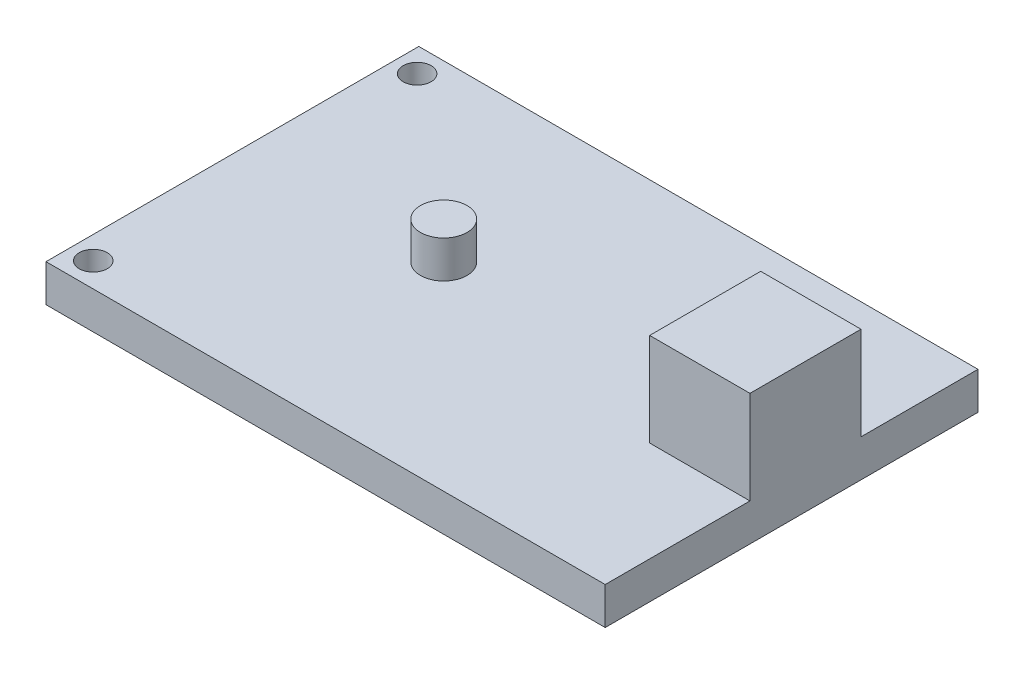
ISO-10303-21;
HEADER;
FILE_DESCRIPTION(('STEP AP214'),'2;1');
FILE_NAME('part.step','',(''),(''),'','','');
FILE_SCHEMA(('AUTOMOTIVE_DESIGN { 1 0 10303 214 1 1 1 1 }'));
ENDSEC;
DATA;
#1=APPLICATION_CONTEXT('core data for automotive mechanical design processes');
#2=APPLICATION_PROTOCOL_DEFINITION('international standard','automotive_design',2000,#1);
#3=PRODUCT_CONTEXT('',#1,'mechanical');
#4=PRODUCT('Part','Part','',(#3));
#5=PRODUCT_RELATED_PRODUCT_CATEGORY('part','',(#4));
#6=PRODUCT_DEFINITION_FORMATION('','',#4);
#7=PRODUCT_DEFINITION_CONTEXT('part definition',#1,'design');
#8=PRODUCT_DEFINITION('design','',#6,#7);
#9=PRODUCT_DEFINITION_SHAPE('','',#8);
#10=(LENGTH_UNIT() NAMED_UNIT(*) SI_UNIT(.MILLI.,.METRE.));
#11=(NAMED_UNIT(*) PLANE_ANGLE_UNIT() SI_UNIT($,.RADIAN.));
#12=(NAMED_UNIT(*) SI_UNIT($,.STERADIAN.) SOLID_ANGLE_UNIT());
#13=UNCERTAINTY_MEASURE_WITH_UNIT(LENGTH_MEASURE(1.E-05),#10,'distance_accuracy_value','');
#14=(GEOMETRIC_REPRESENTATION_CONTEXT(3) GLOBAL_UNCERTAINTY_ASSIGNED_CONTEXT((#13)) GLOBAL_UNIT_ASSIGNED_CONTEXT((#10,
#11,#12)) REPRESENTATION_CONTEXT('',''));
#15=CARTESIAN_POINT('',(0.,0.,0.));
#16=DIRECTION('',(0.,0.,1.));
#17=DIRECTION('',(1.,0.,0.));
#18=AXIS2_PLACEMENT_3D('',#15,#16,#17);
#19=CARTESIAN_POINT('',(0.,2.,0.));
#20=DIRECTION('',(0.,1.,0.));
#21=DIRECTION('',(0.,0.,1.));
#22=AXIS2_PLACEMENT_3D('',#19,#20,#21);
#23=PLANE('',#22);
#24=CARTESIAN_POINT('',(-4.31314717029003,2.,-0.651626550907135));
#25=DIRECTION('',(0.,1.,0.));
#26=DIRECTION('',(0.,0.,1.));
#27=AXIS2_PLACEMENT_3D('',#24,#25,#26);
#28=CIRCLE('',#27,1.25);
#29=CARTESIAN_POINT('',(-4.31314717029003,2.,0.598373449092865));
#30=VERTEX_POINT('',#29);
#31=EDGE_CURVE('E140',#30,#30,#28,.T.);
#32=ORIENTED_EDGE('',*,*,#31,.F.);
#33=EDGE_LOOP('',(#32));
#34=FACE_BOUND('',#33,.T.);
#35=CARTESIAN_POINT('',(-13.7772470763221,2.,-8.68835401209501));
#36=DIRECTION('',(0.,-1.,0.));
#37=DIRECTION('',(0.,0.,-1.));
#38=AXIS2_PLACEMENT_3D('',#35,#36,#37);
#39=CIRCLE('',#38,0.75);
#40=CARTESIAN_POINT('',(-13.7772470763221,2.,-9.43835401209501));
#41=VERTEX_POINT('',#40);
#42=EDGE_CURVE('E149',#41,#41,#39,.T.);
#43=ORIENTED_EDGE('',*,*,#42,.T.);
#44=EDGE_LOOP('',(#43));
#45=FACE_BOUND('',#44,.T.);
#46=CARTESIAN_POINT('',(-13.7772470763221,2.,8.68835401209501));
#47=DIRECTION('',(0.,1.,0.));
#48=DIRECTION('',(0.,0.,1.));
#49=AXIS2_PLACEMENT_3D('',#46,#47,#48);
#50=CIRCLE('',#49,0.75);
#51=CARTESIAN_POINT('',(-13.7772470763221,2.,9.43835401209501));
#52=VERTEX_POINT('',#51);
#53=EDGE_CURVE('E154',#52,#52,#50,.T.);
#54=ORIENTED_EDGE('',*,*,#53,.F.);
#55=EDGE_LOOP('',(#54));
#56=FACE_BOUND('',#55,.T.);
#57=DIRECTION('',(0.,0.,1.));
#58=VECTOR('',#57,1.);
#59=CARTESIAN_POINT('',(9.61924908481949,2.,-3.72358029089787));
#60=LINE('',#59,#58);
#61=CARTESIAN_POINT('',(9.61924908481949,2.,-3.72358029089787));
#62=VERTEX_POINT('',#61);
#63=CARTESIAN_POINT('',(9.61924908481949,2.,2.23414817453872));
#64=VERTEX_POINT('',#63);
#65=EDGE_CURVE('E331',#62,#64,#60,.T.);
#66=ORIENTED_EDGE('',*,*,#65,.F.);
#67=DIRECTION('',(-1.,0.,0.));
#68=VECTOR('',#67,1.);
#69=CARTESIAN_POINT('',(15.,2.,-3.72358029089787));
#70=LINE('',#69,#68);
#71=CARTESIAN_POINT('',(15.,2.,-3.72358029089787));
#72=VERTEX_POINT('',#71);
#73=EDGE_CURVE('E332',#72,#62,#70,.T.);
#74=ORIENTED_EDGE('',*,*,#73,.F.);
#75=DIRECTION('',(0.,0.,-1.));
#76=VECTOR('',#75,1.);
#77=CARTESIAN_POINT('',(15.,2.,-10.));
#78=LINE('',#77,#76);
#79=CARTESIAN_POINT('',(15.,2.,-10.));
#80=VERTEX_POINT('',#79);
#81=EDGE_CURVE('E95',#72,#80,#78,.T.);
#82=ORIENTED_EDGE('',*,*,#81,.T.);
#83=DIRECTION('',(-1.,0.,0.));
#84=VECTOR('',#83,1.);
#85=CARTESIAN_POINT('',(-15.,2.,-10.));
#86=LINE('',#85,#84);
#87=CARTESIAN_POINT('',(-15.,2.,-10.));
#88=VERTEX_POINT('',#87);
#89=EDGE_CURVE('E165',#80,#88,#86,.T.);
#90=ORIENTED_EDGE('',*,*,#89,.T.);
#91=DIRECTION('',(0.,0.,1.));
#92=VECTOR('',#91,1.);
#93=CARTESIAN_POINT('',(-15.,2.,-10.));
#94=LINE('',#93,#92);
#95=CARTESIAN_POINT('',(-15.,2.,10.));
#96=VERTEX_POINT('',#95);
#97=EDGE_CURVE('E167',#88,#96,#94,.T.);
#98=ORIENTED_EDGE('',*,*,#97,.T.);
#99=DIRECTION('',(1.,0.,0.));
#100=VECTOR('',#99,1.);
#101=CARTESIAN_POINT('',(-15.,2.,10.));
#102=LINE('',#101,#100);
#103=CARTESIAN_POINT('',(15.,2.,10.));
#104=VERTEX_POINT('',#103);
#105=EDGE_CURVE('E67',#96,#104,#102,.T.);
#106=ORIENTED_EDGE('',*,*,#105,.T.);
#107=CARTESIAN_POINT('',(15.,2.,2.23414817453872));
#108=VERTEX_POINT('',#107);
#109=EDGE_CURVE('E163',#104,#108,#78,.T.);
#110=ORIENTED_EDGE('',*,*,#109,.T.);
#111=DIRECTION('',(1.,0.,0.));
#112=VECTOR('',#111,1.);
#113=CARTESIAN_POINT('',(15.,2.,2.23414817453872));
#114=LINE('',#113,#112);
#115=EDGE_CURVE('E136',#64,#108,#114,.T.);
#116=ORIENTED_EDGE('',*,*,#115,.F.);
#117=EDGE_LOOP('',(#66,#74,#82,#90,#98,#106,#110,#116));
#118=FACE_BOUND('',#117,.T.);
#119=ADVANCED_FACE('F43',(#34,#45,#56,#118),#23,.T.);
#120=CARTESIAN_POINT('',(15.,2.,-10.));
#121=DIRECTION('',(-1.,0.,0.));
#122=DIRECTION('',(0.,0.,1.));
#123=AXIS2_PLACEMENT_3D('',#120,#121,#122);
#124=PLANE('',#123);
#125=DIRECTION('',(0.,0.,-1.));
#126=VECTOR('',#125,1.);
#127=CARTESIAN_POINT('',(15.,0.,-10.));
#128=LINE('',#127,#126);
#129=CARTESIAN_POINT('',(15.,0.,10.));
#130=VERTEX_POINT('',#129);
#131=CARTESIAN_POINT('',(15.,0.,-10.));
#132=VERTEX_POINT('',#131);
#133=EDGE_CURVE('E160',#130,#132,#128,.T.);
#134=ORIENTED_EDGE('',*,*,#133,.T.);
#135=DIRECTION('',(0.,-1.,0.));
#136=VECTOR('',#135,1.);
#137=CARTESIAN_POINT('',(15.,2.,-10.));
#138=LINE('',#137,#136);
#139=EDGE_CURVE('E11',#80,#132,#138,.T.);
#140=ORIENTED_EDGE('',*,*,#139,.F.);
#141=ORIENTED_EDGE('',*,*,#81,.F.);
#142=DIRECTION('',(0.,-1.,0.));
#143=VECTOR('',#142,1.);
#144=CARTESIAN_POINT('',(15.,7.,-3.72358029089787));
#145=LINE('',#144,#143);
#146=CARTESIAN_POINT('',(15.,7.,-3.72358029089787));
#147=VERTEX_POINT('',#146);
#148=EDGE_CURVE('E122',#147,#72,#145,.T.);
#149=ORIENTED_EDGE('',*,*,#148,.F.);
#150=DIRECTION('',(0.,0.,-1.));
#151=VECTOR('',#150,1.);
#152=CARTESIAN_POINT('',(15.,7.,-3.72358029089787));
#153=LINE('',#152,#151);
#154=CARTESIAN_POINT('',(15.,7.,2.23414817453872));
#155=VERTEX_POINT('',#154);
#156=EDGE_CURVE('E128',#155,#147,#153,.T.);
#157=ORIENTED_EDGE('',*,*,#156,.F.);
#158=DIRECTION('',(0.,-1.,0.));
#159=VECTOR('',#158,1.);
#160=CARTESIAN_POINT('',(15.,7.,2.23414817453872));
#161=LINE('',#160,#159);
#162=EDGE_CURVE('E338',#155,#108,#161,.T.);
#163=ORIENTED_EDGE('',*,*,#162,.T.);
#164=ORIENTED_EDGE('',*,*,#109,.F.);
#165=DIRECTION('',(0.,-1.,0.));
#166=VECTOR('',#165,1.);
#167=CARTESIAN_POINT('',(15.,2.,10.));
#168=LINE('',#167,#166);
#169=EDGE_CURVE('E170',#104,#130,#168,.T.);
#170=ORIENTED_EDGE('',*,*,#169,.T.);
#171=EDGE_LOOP('',(#134,#140,#141,#149,#157,#163,#164,#170));
#172=FACE_BOUND('',#171,.T.);
#173=ADVANCED_FACE('F45',(#172),#124,.F.);
#174=CARTESIAN_POINT('',(-15.,2.,-10.));
#175=DIRECTION('',(0.,0.,1.));
#176=DIRECTION('',(1.,0.,0.));
#177=AXIS2_PLACEMENT_3D('',#174,#175,#176);
#178=PLANE('',#177);
#179=DIRECTION('',(-1.,0.,0.));
#180=VECTOR('',#179,1.);
#181=CARTESIAN_POINT('',(-15.,0.,-10.));
#182=LINE('',#181,#180);
#183=CARTESIAN_POINT('',(-15.,0.,-10.));
#184=VERTEX_POINT('',#183);
#185=EDGE_CURVE('E172',#132,#184,#182,.T.);
#186=ORIENTED_EDGE('',*,*,#185,.T.);
#187=DIRECTION('',(0.,-1.,0.));
#188=VECTOR('',#187,1.);
#189=CARTESIAN_POINT('',(-15.,2.,-10.));
#190=LINE('',#189,#188);
#191=EDGE_CURVE('E51',#88,#184,#190,.T.);
#192=ORIENTED_EDGE('',*,*,#191,.F.);
#193=ORIENTED_EDGE('',*,*,#89,.F.);
#194=ORIENTED_EDGE('',*,*,#139,.T.);
#195=EDGE_LOOP('',(#186,#192,#193,#194));
#196=FACE_BOUND('',#195,.T.);
#197=ADVANCED_FACE('F201',(#196),#178,.F.);
#198=CARTESIAN_POINT('',(-15.,2.,-10.));
#199=DIRECTION('',(1.,0.,0.));
#200=DIRECTION('',(0.,0.,-1.));
#201=AXIS2_PLACEMENT_3D('',#198,#199,#200);
#202=PLANE('',#201);
#203=DIRECTION('',(0.,0.,1.));
#204=VECTOR('',#203,1.);
#205=CARTESIAN_POINT('',(-15.,0.,-10.));
#206=LINE('',#205,#204);
#207=CARTESIAN_POINT('',(-15.,0.,10.));
#208=VERTEX_POINT('',#207);
#209=EDGE_CURVE('E174',#184,#208,#206,.T.);
#210=ORIENTED_EDGE('',*,*,#209,.T.);
#211=DIRECTION('',(0.,-1.,0.));
#212=VECTOR('',#211,1.);
#213=CARTESIAN_POINT('',(-15.,2.,10.));
#214=LINE('',#213,#212);
#215=EDGE_CURVE('E178',#96,#208,#214,.T.);
#216=ORIENTED_EDGE('',*,*,#215,.F.);
#217=ORIENTED_EDGE('',*,*,#97,.F.);
#218=ORIENTED_EDGE('',*,*,#191,.T.);
#219=EDGE_LOOP('',(#210,#216,#217,#218));
#220=FACE_BOUND('',#219,.T.);
#221=ADVANCED_FACE('F184',(#220),#202,.F.);
#222=CARTESIAN_POINT('',(-15.,2.,10.));
#223=DIRECTION('',(0.,0.,-1.));
#224=DIRECTION('',(-1.,0.,0.));
#225=AXIS2_PLACEMENT_3D('',#222,#223,#224);
#226=PLANE('',#225);
#227=DIRECTION('',(1.,0.,0.));
#228=VECTOR('',#227,1.);
#229=CARTESIAN_POINT('',(-15.,0.,10.));
#230=LINE('',#229,#228);
#231=EDGE_CURVE('E88',#208,#130,#230,.T.);
#232=ORIENTED_EDGE('',*,*,#231,.T.);
#233=ORIENTED_EDGE('',*,*,#169,.F.);
#234=ORIENTED_EDGE('',*,*,#105,.F.);
#235=ORIENTED_EDGE('',*,*,#215,.T.);
#236=EDGE_LOOP('',(#232,#233,#234,#235));
#237=FACE_BOUND('',#236,.T.);
#238=ADVANCED_FACE('F191',(#237),#226,.F.);
#239=CARTESIAN_POINT('',(0.,0.,0.));
#240=DIRECTION('',(0.,1.,0.));
#241=DIRECTION('',(0.,0.,1.));
#242=AXIS2_PLACEMENT_3D('',#239,#240,#241);
#243=PLANE('',#242);
#244=CARTESIAN_POINT('',(-13.7772470763221,0.,-8.68835401209501));
#245=DIRECTION('',(0.,-1.,0.));
#246=DIRECTION('',(0.,0.,-1.));
#247=AXIS2_PLACEMENT_3D('',#244,#245,#246);
#248=CIRCLE('',#247,0.75);
#249=CARTESIAN_POINT('',(-13.7772470763221,0.,-9.43835401209501));
#250=VERTEX_POINT('',#249);
#251=EDGE_CURVE('E151',#250,#250,#248,.T.);
#252=ORIENTED_EDGE('',*,*,#251,.F.);
#253=EDGE_LOOP('',(#252));
#254=FACE_BOUND('',#253,.T.);
#255=CARTESIAN_POINT('',(-13.7772470763221,0.,8.68835401209501));
#256=DIRECTION('',(0.,1.,0.));
#257=DIRECTION('',(0.,0.,1.));
#258=AXIS2_PLACEMENT_3D('',#255,#256,#257);
#259=CIRCLE('',#258,0.75);
#260=CARTESIAN_POINT('',(-13.7772470763221,0.,9.43835401209501));
#261=VERTEX_POINT('',#260);
#262=EDGE_CURVE('E157',#261,#261,#259,.T.);
#263=ORIENTED_EDGE('',*,*,#262,.T.);
#264=EDGE_LOOP('',(#263));
#265=FACE_BOUND('',#264,.T.);
#266=ORIENTED_EDGE('',*,*,#133,.F.);
#267=ORIENTED_EDGE('',*,*,#231,.F.);
#268=ORIENTED_EDGE('',*,*,#209,.F.);
#269=ORIENTED_EDGE('',*,*,#185,.F.);
#270=EDGE_LOOP('',(#266,#267,#268,#269));
#271=FACE_BOUND('',#270,.T.);
#272=ADVANCED_FACE('F189',(#254,#265,#271),#243,.F.);
#273=CARTESIAN_POINT('',(-13.7772470763221,0.,8.68835401209501));
#274=DIRECTION('',(0.,1.,0.));
#275=DIRECTION('',(0.,0.,1.));
#276=AXIS2_PLACEMENT_3D('',#273,#274,#275);
#277=CYLINDRICAL_SURFACE('',#276,0.75);
#278=ORIENTED_EDGE('',*,*,#262,.F.);
#279=EDGE_LOOP('',(#278));
#280=FACE_BOUND('',#279,.T.);
#281=ORIENTED_EDGE('',*,*,#53,.T.);
#282=EDGE_LOOP('',(#281));
#283=FACE_BOUND('',#282,.T.);
#284=ADVANCED_FACE('F198',(#280,#283),#277,.F.);
#285=CARTESIAN_POINT('',(-13.7772470763221,0.,-8.68835401209501));
#286=DIRECTION('',(0.,1.,0.));
#287=DIRECTION('',(0.,0.,1.));
#288=AXIS2_PLACEMENT_3D('',#285,#286,#287);
#289=CYLINDRICAL_SURFACE('',#288,0.75);
#290=ORIENTED_EDGE('',*,*,#251,.T.);
#291=EDGE_LOOP('',(#290));
#292=FACE_BOUND('',#291,.T.);
#293=ORIENTED_EDGE('',*,*,#42,.F.);
#294=EDGE_LOOP('',(#293));
#295=FACE_BOUND('',#294,.T.);
#296=ADVANCED_FACE('F214',(#292,#295),#289,.F.);
#297=CARTESIAN_POINT('',(-4.31314717029003,4.,-0.651626550907135));
#298=DIRECTION('',(0.,-1.,0.));
#299=DIRECTION('',(0.,0.,-1.));
#300=AXIS2_PLACEMENT_3D('',#297,#298,#299);
#301=CYLINDRICAL_SURFACE('',#300,1.25);
#302=CARTESIAN_POINT('',(-4.31314717029003,4.,-0.651626550907135));
#303=DIRECTION('',(0.,1.,0.));
#304=DIRECTION('',(0.,0.,1.));
#305=AXIS2_PLACEMENT_3D('',#302,#303,#304);
#306=CIRCLE('',#305,1.25);
#307=CARTESIAN_POINT('',(-4.31314717029003,4.,0.598373449092865));
#308=VERTEX_POINT('',#307);
#309=EDGE_CURVE('E143',#308,#308,#306,.T.);
#310=ORIENTED_EDGE('',*,*,#309,.F.);
#311=EDGE_LOOP('',(#310));
#312=FACE_BOUND('',#311,.T.);
#313=ORIENTED_EDGE('',*,*,#31,.T.);
#314=EDGE_LOOP('',(#313));
#315=FACE_BOUND('',#314,.T.);
#316=ADVANCED_FACE('F218',(#312,#315),#301,.T.);
#317=CARTESIAN_POINT('',(-4.31314717029003,4.,-0.651626550907135));
#318=DIRECTION('',(0.,1.,0.));
#319=DIRECTION('',(0.,0.,1.));
#320=AXIS2_PLACEMENT_3D('',#317,#318,#319);
#321=PLANE('',#320);
#322=ORIENTED_EDGE('',*,*,#309,.T.);
#323=EDGE_LOOP('',(#322));
#324=FACE_BOUND('',#323,.T.);
#325=ADVANCED_FACE('F222',(#324),#321,.T.);
#326=CARTESIAN_POINT('',(15.,7.,-3.72358029089787));
#327=DIRECTION('',(0.,0.,1.));
#328=DIRECTION('',(1.,0.,0.));
#329=AXIS2_PLACEMENT_3D('',#326,#327,#328);
#330=PLANE('',#329);
#331=ORIENTED_EDGE('',*,*,#73,.T.);
#332=DIRECTION('',(0.,-1.,0.));
#333=VECTOR('',#332,1.);
#334=CARTESIAN_POINT('',(9.61924908481949,7.,-3.72358029089787));
#335=LINE('',#334,#333);
#336=CARTESIAN_POINT('',(9.61924908481949,7.,-3.72358029089787));
#337=VERTEX_POINT('',#336);
#338=EDGE_CURVE('E124',#337,#62,#335,.T.);
#339=ORIENTED_EDGE('',*,*,#338,.F.);
#340=DIRECTION('',(-1.,0.,0.));
#341=VECTOR('',#340,1.);
#342=CARTESIAN_POINT('',(15.,7.,-3.72358029089787));
#343=LINE('',#342,#341);
#344=EDGE_CURVE('E118',#147,#337,#343,.T.);
#345=ORIENTED_EDGE('',*,*,#344,.F.);
#346=ORIENTED_EDGE('',*,*,#148,.T.);
#347=EDGE_LOOP('',(#331,#339,#345,#346));
#348=FACE_BOUND('',#347,.T.);
#349=ADVANCED_FACE('F120',(#348),#330,.F.);
#350=CARTESIAN_POINT('',(9.61924908481949,7.,-3.72358029089787));
#351=DIRECTION('',(1.,0.,0.));
#352=DIRECTION('',(0.,0.,-1.));
#353=AXIS2_PLACEMENT_3D('',#350,#351,#352);
#354=PLANE('',#353);
#355=ORIENTED_EDGE('',*,*,#65,.T.);
#356=DIRECTION('',(0.,-1.,0.));
#357=VECTOR('',#356,1.);
#358=CARTESIAN_POINT('',(9.61924908481949,7.,2.23414817453872));
#359=LINE('',#358,#357);
#360=CARTESIAN_POINT('',(9.61924908481949,7.,2.23414817453872));
#361=VERTEX_POINT('',#360);
#362=EDGE_CURVE('E58',#361,#64,#359,.T.);
#363=ORIENTED_EDGE('',*,*,#362,.F.);
#364=DIRECTION('',(0.,0.,1.));
#365=VECTOR('',#364,1.);
#366=CARTESIAN_POINT('',(9.61924908481949,7.,-3.72358029089787));
#367=LINE('',#366,#365);
#368=EDGE_CURVE('E127',#337,#361,#367,.T.);
#369=ORIENTED_EDGE('',*,*,#368,.F.);
#370=ORIENTED_EDGE('',*,*,#338,.T.);
#371=EDGE_LOOP('',(#355,#363,#369,#370));
#372=FACE_BOUND('',#371,.T.);
#373=ADVANCED_FACE('F229',(#372),#354,.F.);
#374=CARTESIAN_POINT('',(15.,7.,2.23414817453872));
#375=DIRECTION('',(0.,0.,-1.));
#376=DIRECTION('',(-1.,0.,0.));
#377=AXIS2_PLACEMENT_3D('',#374,#375,#376);
#378=PLANE('',#377);
#379=ORIENTED_EDGE('',*,*,#115,.T.);
#380=ORIENTED_EDGE('',*,*,#162,.F.);
#381=DIRECTION('',(1.,0.,0.));
#382=VECTOR('',#381,1.);
#383=CARTESIAN_POINT('',(15.,7.,2.23414817453872));
#384=LINE('',#383,#382);
#385=EDGE_CURVE('E132',#361,#155,#384,.T.);
#386=ORIENTED_EDGE('',*,*,#385,.F.);
#387=ORIENTED_EDGE('',*,*,#362,.T.);
#388=EDGE_LOOP('',(#379,#380,#386,#387));
#389=FACE_BOUND('',#388,.T.);
#390=ADVANCED_FACE('F232',(#389),#378,.F.);
#391=CARTESIAN_POINT('',(0.,7.,0.));
#392=DIRECTION('',(0.,-1.,0.));
#393=DIRECTION('',(0.,0.,-1.));
#394=AXIS2_PLACEMENT_3D('',#391,#392,#393);
#395=PLANE('',#394);
#396=ORIENTED_EDGE('',*,*,#156,.T.);
#397=ORIENTED_EDGE('',*,*,#344,.T.);
#398=ORIENTED_EDGE('',*,*,#368,.T.);
#399=ORIENTED_EDGE('',*,*,#385,.T.);
#400=EDGE_LOOP('',(#396,#397,#398,#399));
#401=FACE_BOUND('',#400,.T.);
#402=ADVANCED_FACE('F131',(#401),#395,.F.);
#403=CLOSED_SHELL('',(#119,#173,#197,#221,#238,#272,#284,#296,#316,#325,#349,#373,#390,#402));
#404=MANIFOLD_SOLID_BREP('B2',#403);
#405=ADVANCED_BREP_SHAPE_REPRESENTATION('',(#18,#404),#14);
#406=SHAPE_DEFINITION_REPRESENTATION(#9,#405);
ENDSEC;
END-ISO-10303-21;
